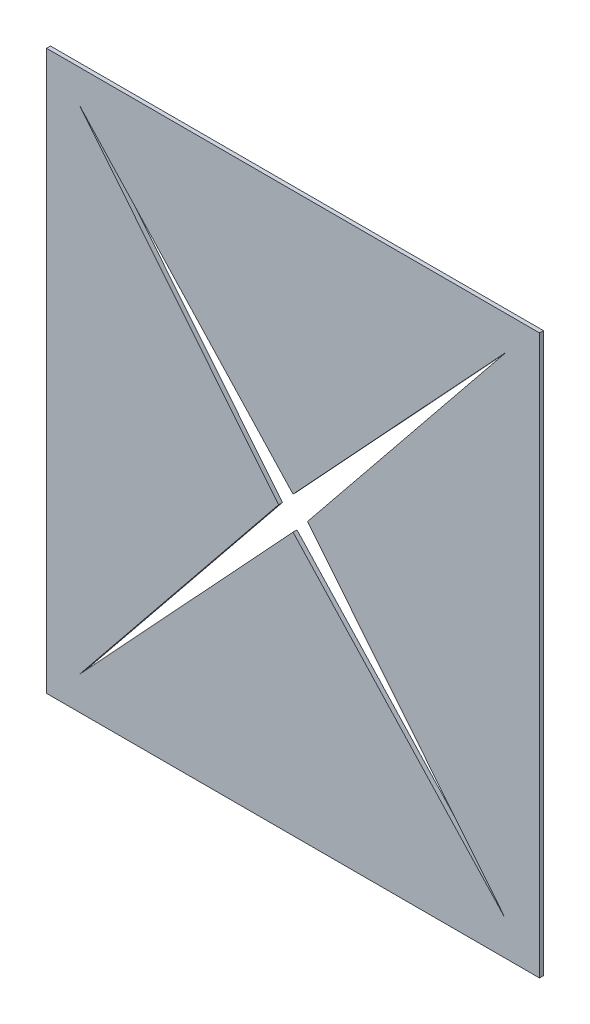
ISO-10303-21;
HEADER;
FILE_DESCRIPTION(('STEP AP214'),'2;1');
FILE_NAME('part.step','',(''),(''),'','','');
FILE_SCHEMA(('AUTOMOTIVE_DESIGN { 1 0 10303 214 1 1 1 1 }'));
ENDSEC;
DATA;
#1=APPLICATION_CONTEXT('core data for automotive mechanical design processes');
#2=APPLICATION_PROTOCOL_DEFINITION('international standard','automotive_design',2000,#1);
#3=PRODUCT_CONTEXT('',#1,'mechanical');
#4=PRODUCT('Part','Part','',(#3));
#5=PRODUCT_RELATED_PRODUCT_CATEGORY('part','',(#4));
#6=PRODUCT_DEFINITION_FORMATION('','',#4);
#7=PRODUCT_DEFINITION_CONTEXT('part definition',#1,'design');
#8=PRODUCT_DEFINITION('design','',#6,#7);
#9=PRODUCT_DEFINITION_SHAPE('','',#8);
#10=(LENGTH_UNIT() NAMED_UNIT(*) SI_UNIT(.MILLI.,.METRE.));
#11=(NAMED_UNIT(*) PLANE_ANGLE_UNIT() SI_UNIT($,.RADIAN.));
#12=(NAMED_UNIT(*) SI_UNIT($,.STERADIAN.) SOLID_ANGLE_UNIT());
#13=UNCERTAINTY_MEASURE_WITH_UNIT(LENGTH_MEASURE(1.E-05),#10,'distance_accuracy_value','');
#14=(GEOMETRIC_REPRESENTATION_CONTEXT(3) GLOBAL_UNCERTAINTY_ASSIGNED_CONTEXT((#13)) GLOBAL_UNIT_ASSIGNED_CONTEXT((#10,
#11,#12)) REPRESENTATION_CONTEXT('',''));
#15=CARTESIAN_POINT('',(0.,0.,0.));
#16=DIRECTION('',(0.,0.,1.));
#17=DIRECTION('',(1.,0.,0.));
#18=AXIS2_PLACEMENT_3D('',#15,#16,#17);
#19=CARTESIAN_POINT('',(1.58315068493149,-1.47006849315067,0.762));
#20=DIRECTION('',(0.7327934916263,-0.680451099367277,0.));
#21=DIRECTION('',(0.680451099367277,0.7327934916263,0.));
#22=AXIS2_PLACEMENT_3D('',#19,#20,#21);
#23=PLANE('',#22);
#24=DIRECTION('',(-0.680451099367277,-0.7327934916263,0.));
#25=VECTOR('',#24,1.);
#26=CARTESIAN_POINT('',(1.58315068493149,-1.47006849315067,0.));
#27=LINE('',#26,#25);
#28=CARTESIAN_POINT('',(0.,-3.17499999999999,0.));
#29=VERTEX_POINT('',#28);
#30=CARTESIAN_POINT('',(-41.275,-47.625,0.));
#31=VERTEX_POINT('',#30);
#32=EDGE_CURVE('E167',#29,#31,#27,.T.);
#33=ORIENTED_EDGE('',*,*,#32,.T.);
#34=DIRECTION('',(0.,0.,-1.));
#35=VECTOR('',#34,1.);
#36=CARTESIAN_POINT('',(-41.275,-47.625,0.762));
#37=LINE('',#36,#35);
#38=CARTESIAN_POINT('',(-41.275,-47.625,0.762));
#39=VERTEX_POINT('',#38);
#40=EDGE_CURVE('E11',#39,#31,#37,.T.);
#41=ORIENTED_EDGE('',*,*,#40,.F.);
#42=DIRECTION('',(-0.680451099367277,-0.7327934916263,0.));
#43=VECTOR('',#42,1.);
#44=CARTESIAN_POINT('',(1.58315068493149,-1.47006849315067,0.762));
#45=LINE('',#44,#43);
#46=CARTESIAN_POINT('',(0.,-3.17499999999999,0.762));
#47=VERTEX_POINT('',#46);
#48=EDGE_CURVE('E221',#47,#39,#45,.T.);
#49=ORIENTED_EDGE('',*,*,#48,.F.);
#50=DIRECTION('',(0.,0.,-1.));
#51=VECTOR('',#50,1.);
#52=CARTESIAN_POINT('',(0.,-3.17499999999999,0.762));
#53=LINE('',#52,#51);
#54=EDGE_CURVE('E187',#47,#29,#53,.T.);
#55=ORIENTED_EDGE('',*,*,#54,.T.);
#56=EDGE_LOOP('',(#33,#41,#49,#55));
#57=FACE_BOUND('',#56,.T.);
#58=ADVANCED_FACE('F35',(#57),#23,.F.);
#59=CARTESIAN_POINT('',(-1.69517894864186,1.3694386800793,0.762));
#60=DIRECTION('',(0.77788382600443,-0.628408110419264,0.));
#61=DIRECTION('',(0.628408110419264,0.77788382600443,0.));
#62=AXIS2_PLACEMENT_3D('',#59,#60,#61);
#63=PLANE('',#62);
#64=DIRECTION('',(-0.628408110419264,-0.77788382600443,0.));
#65=VECTOR('',#64,1.);
#66=CARTESIAN_POINT('',(-1.69517894864186,1.3694386800793,0.));
#67=LINE('',#66,#65);
#68=CARTESIAN_POINT('',(-2.80147058823532,0.,0.));
#69=VERTEX_POINT('',#68);
#70=EDGE_CURVE('E170',#69,#31,#67,.T.);
#71=ORIENTED_EDGE('',*,*,#70,.F.);
#72=DIRECTION('',(0.,0.,-1.));
#73=VECTOR('',#72,1.);
#74=CARTESIAN_POINT('',(-2.80147058823532,0.,0.762));
#75=LINE('',#74,#73);
#76=CARTESIAN_POINT('',(-2.80147058823532,0.,0.762));
#77=VERTEX_POINT('',#76);
#78=EDGE_CURVE('E45',#77,#69,#75,.T.);
#79=ORIENTED_EDGE('',*,*,#78,.F.);
#80=DIRECTION('',(-0.628408110419264,-0.77788382600443,0.));
#81=VECTOR('',#80,1.);
#82=CARTESIAN_POINT('',(-1.69517894864186,1.3694386800793,0.762));
#83=LINE('',#82,#81);
#84=EDGE_CURVE('E224',#77,#39,#83,.T.);
#85=ORIENTED_EDGE('',*,*,#84,.T.);
#86=ORIENTED_EDGE('',*,*,#40,.T.);
#87=EDGE_LOOP('',(#71,#79,#85,#86));
#88=FACE_BOUND('',#87,.T.);
#89=ADVANCED_FACE('F257',(#88),#63,.T.);
#90=CARTESIAN_POINT('',(-1.69517894864185,-1.36943868007929,0.762));
#91=DIRECTION('',(0.77788382600443,0.628408110419264,0.));
#92=DIRECTION('',(-0.628408110419264,0.77788382600443,0.));
#93=AXIS2_PLACEMENT_3D('',#90,#91,#92);
#94=PLANE('',#93);
#95=DIRECTION('',(0.628408110419264,-0.77788382600443,0.));
#96=VECTOR('',#95,1.);
#97=CARTESIAN_POINT('',(-1.69517894864185,-1.36943868007929,0.));
#98=LINE('',#97,#96);
#99=CARTESIAN_POINT('',(-41.275,47.625,0.));
#100=VERTEX_POINT('',#99);
#101=EDGE_CURVE('E173',#100,#69,#98,.T.);
#102=ORIENTED_EDGE('',*,*,#101,.F.);
#103=DIRECTION('',(0.,0.,-1.));
#104=VECTOR('',#103,1.);
#105=CARTESIAN_POINT('',(-41.275,47.625,0.762));
#106=LINE('',#105,#104);
#107=CARTESIAN_POINT('',(-41.275,47.625,0.762));
#108=VERTEX_POINT('',#107);
#109=EDGE_CURVE('E193',#108,#100,#106,.T.);
#110=ORIENTED_EDGE('',*,*,#109,.F.);
#111=DIRECTION('',(0.628408110419264,-0.77788382600443,0.));
#112=VECTOR('',#111,1.);
#113=CARTESIAN_POINT('',(-1.69517894864185,-1.36943868007929,0.762));
#114=LINE('',#113,#112);
#115=EDGE_CURVE('E231',#108,#77,#114,.T.);
#116=ORIENTED_EDGE('',*,*,#115,.T.);
#117=ORIENTED_EDGE('',*,*,#78,.T.);
#118=EDGE_LOOP('',(#102,#110,#116,#117));
#119=FACE_BOUND('',#118,.T.);
#120=ADVANCED_FACE('F262',(#119),#94,.T.);
#121=CARTESIAN_POINT('',(1.5831506849315,1.47006849315068,0.762));
#122=DIRECTION('',(-0.732793491626299,-0.680451099367278,0.));
#123=DIRECTION('',(0.680451099367278,-0.732793491626299,0.));
#124=AXIS2_PLACEMENT_3D('',#121,#122,#123);
#125=PLANE('',#124);
#126=DIRECTION('',(-0.680451099367278,0.732793491626299,0.));
#127=VECTOR('',#126,1.);
#128=CARTESIAN_POINT('',(1.5831506849315,1.47006849315068,0.));
#129=LINE('',#128,#127);
#130=CARTESIAN_POINT('',(0.,3.17500000000001,0.));
#131=VERTEX_POINT('',#130);
#132=EDGE_CURVE('E176',#131,#100,#129,.T.);
#133=ORIENTED_EDGE('',*,*,#132,.F.);
#134=DIRECTION('',(0.,0.,-1.));
#135=VECTOR('',#134,1.);
#136=CARTESIAN_POINT('',(0.,3.17500000000001,0.762));
#137=LINE('',#136,#135);
#138=CARTESIAN_POINT('',(0.,3.17500000000001,0.762));
#139=VERTEX_POINT('',#138);
#140=EDGE_CURVE('E191',#139,#131,#137,.T.);
#141=ORIENTED_EDGE('',*,*,#140,.F.);
#142=DIRECTION('',(-0.680451099367278,0.732793491626299,0.));
#143=VECTOR('',#142,1.);
#144=CARTESIAN_POINT('',(1.5831506849315,1.47006849315068,0.762));
#145=LINE('',#144,#143);
#146=EDGE_CURVE('E234',#139,#108,#145,.T.);
#147=ORIENTED_EDGE('',*,*,#146,.T.);
#148=ORIENTED_EDGE('',*,*,#109,.T.);
#149=EDGE_LOOP('',(#133,#141,#147,#148));
#150=FACE_BOUND('',#149,.T.);
#151=ADVANCED_FACE('F282',(#150),#125,.T.);
#152=CARTESIAN_POINT('',(-1.58315068493152,1.4700684931507,0.762));
#153=DIRECTION('',(0.732793491626299,-0.680451099367278,0.));
#154=DIRECTION('',(0.680451099367278,0.732793491626299,0.));
#155=AXIS2_PLACEMENT_3D('',#152,#153,#154);
#156=PLANE('',#155);
#157=DIRECTION('',(-0.680451099367278,-0.732793491626299,0.));
#158=VECTOR('',#157,1.);
#159=CARTESIAN_POINT('',(-1.58315068493152,1.4700684931507,0.));
#160=LINE('',#159,#158);
#161=CARTESIAN_POINT('',(41.275,47.625,0.));
#162=VERTEX_POINT('',#161);
#163=EDGE_CURVE('E179',#162,#131,#160,.T.);
#164=ORIENTED_EDGE('',*,*,#163,.F.);
#165=DIRECTION('',(0.,0.,-1.));
#166=VECTOR('',#165,1.);
#167=CARTESIAN_POINT('',(41.275,47.625,0.762));
#168=LINE('',#167,#166);
#169=CARTESIAN_POINT('',(41.275,47.625,0.762));
#170=VERTEX_POINT('',#169);
#171=EDGE_CURVE('E141',#170,#162,#168,.T.);
#172=ORIENTED_EDGE('',*,*,#171,.F.);
#173=DIRECTION('',(-0.680451099367278,-0.732793491626299,0.));
#174=VECTOR('',#173,1.);
#175=CARTESIAN_POINT('',(-1.58315068493152,1.4700684931507,0.762));
#176=LINE('',#175,#174);
#177=EDGE_CURVE('E148',#170,#139,#176,.T.);
#178=ORIENTED_EDGE('',*,*,#177,.T.);
#179=ORIENTED_EDGE('',*,*,#140,.T.);
#180=EDGE_LOOP('',(#164,#172,#178,#179));
#181=FACE_BOUND('',#180,.T.);
#182=ADVANCED_FACE('F238',(#181),#156,.T.);
#183=CARTESIAN_POINT('',(1.69517894864183,-1.36943868007928,0.762));
#184=DIRECTION('',(-0.777883826004429,0.628408110419264,0.));
#185=DIRECTION('',(-0.628408110419264,-0.77788382600443,0.));
#186=AXIS2_PLACEMENT_3D('',#183,#184,#185);
#187=PLANE('',#186);
#188=DIRECTION('',(0.628408110419264,0.77788382600443,0.));
#189=VECTOR('',#188,1.);
#190=CARTESIAN_POINT('',(1.69517894864183,-1.36943868007928,0.));
#191=LINE('',#190,#189);
#192=CARTESIAN_POINT('',(2.80147058823529,0.,0.));
#193=VERTEX_POINT('',#192);
#194=EDGE_CURVE('E136',#193,#162,#191,.T.);
#195=ORIENTED_EDGE('',*,*,#194,.F.);
#196=DIRECTION('',(0.,0.,-1.));
#197=VECTOR('',#196,1.);
#198=CARTESIAN_POINT('',(2.80147058823529,0.,0.762));
#199=LINE('',#198,#197);
#200=CARTESIAN_POINT('',(2.80147058823529,0.,0.762));
#201=VERTEX_POINT('',#200);
#202=EDGE_CURVE('E131',#201,#193,#199,.T.);
#203=ORIENTED_EDGE('',*,*,#202,.F.);
#204=DIRECTION('',(0.628408110419264,0.77788382600443,0.));
#205=VECTOR('',#204,1.);
#206=CARTESIAN_POINT('',(1.69517894864183,-1.36943868007928,0.762));
#207=LINE('',#206,#205);
#208=EDGE_CURVE('E134',#201,#170,#207,.T.);
#209=ORIENTED_EDGE('',*,*,#208,.T.);
#210=ORIENTED_EDGE('',*,*,#171,.T.);
#211=EDGE_LOOP('',(#195,#203,#209,#210));
#212=FACE_BOUND('',#211,.T.);
#213=ADVANCED_FACE('F133',(#212),#187,.T.);
#214=CARTESIAN_POINT('',(1.69517894864183,1.36943868007929,0.762));
#215=DIRECTION('',(-0.77788382600443,-0.628408110419264,0.));
#216=DIRECTION('',(0.628408110419264,-0.77788382600443,0.));
#217=AXIS2_PLACEMENT_3D('',#214,#215,#216);
#218=PLANE('',#217);
#219=DIRECTION('',(-0.628408110419264,0.77788382600443,0.));
#220=VECTOR('',#219,1.);
#221=CARTESIAN_POINT('',(1.69517894864183,1.36943868007929,0.));
#222=LINE('',#221,#220);
#223=CARTESIAN_POINT('',(41.275,-47.625,0.));
#224=VERTEX_POINT('',#223);
#225=EDGE_CURVE('E183',#224,#193,#222,.T.);
#226=ORIENTED_EDGE('',*,*,#225,.F.);
#227=DIRECTION('',(0.,0.,-1.));
#228=VECTOR('',#227,1.);
#229=CARTESIAN_POINT('',(41.275,-47.625,0.762));
#230=LINE('',#229,#228);
#231=CARTESIAN_POINT('',(41.275,-47.625,0.762));
#232=VERTEX_POINT('',#231);
#233=EDGE_CURVE('E93',#232,#224,#230,.T.);
#234=ORIENTED_EDGE('',*,*,#233,.F.);
#235=DIRECTION('',(-0.628408110419264,0.77788382600443,0.));
#236=VECTOR('',#235,1.);
#237=CARTESIAN_POINT('',(1.69517894864183,1.36943868007929,0.762));
#238=LINE('',#237,#236);
#239=EDGE_CURVE('E145',#232,#201,#238,.T.);
#240=ORIENTED_EDGE('',*,*,#239,.T.);
#241=ORIENTED_EDGE('',*,*,#202,.T.);
#242=EDGE_LOOP('',(#226,#234,#240,#241));
#243=FACE_BOUND('',#242,.T.);
#244=ADVANCED_FACE('F150',(#243),#218,.T.);
#245=CARTESIAN_POINT('',(47.625,0.,0.762));
#246=DIRECTION('',(1.,0.,0.));
#247=DIRECTION('',(0.,0.,-1.));
#248=AXIS2_PLACEMENT_3D('',#245,#246,#247);
#249=PLANE('',#248);
#250=DIRECTION('',(0.,-1.,0.));
#251=VECTOR('',#250,1.);
#252=CARTESIAN_POINT('',(47.625,0.,0.));
#253=LINE('',#252,#251);
#254=CARTESIAN_POINT('',(47.625,53.975,0.));
#255=VERTEX_POINT('',#254);
#256=CARTESIAN_POINT('',(47.625,-53.975,0.));
#257=VERTEX_POINT('',#256);
#258=EDGE_CURVE('E156',#255,#257,#253,.T.);
#259=ORIENTED_EDGE('',*,*,#258,.F.);
#260=DIRECTION('',(0.,0.,-1.));
#261=VECTOR('',#260,1.);
#262=CARTESIAN_POINT('',(47.625,53.975,0.762));
#263=LINE('',#262,#261);
#264=CARTESIAN_POINT('',(47.625,53.975,0.762));
#265=VERTEX_POINT('',#264);
#266=EDGE_CURVE('E39',#265,#255,#263,.T.);
#267=ORIENTED_EDGE('',*,*,#266,.F.);
#268=DIRECTION('',(0.,-1.,0.));
#269=VECTOR('',#268,1.);
#270=CARTESIAN_POINT('',(47.625,0.,0.762));
#271=LINE('',#270,#269);
#272=CARTESIAN_POINT('',(47.625,-53.975,0.762));
#273=VERTEX_POINT('',#272);
#274=EDGE_CURVE('E186',#265,#273,#271,.T.);
#275=ORIENTED_EDGE('',*,*,#274,.T.);
#276=DIRECTION('',(0.,0.,-1.));
#277=VECTOR('',#276,1.);
#278=CARTESIAN_POINT('',(47.625,-53.975,0.762));
#279=LINE('',#278,#277);
#280=EDGE_CURVE('E152',#273,#257,#279,.T.);
#281=ORIENTED_EDGE('',*,*,#280,.T.);
#282=EDGE_LOOP('',(#259,#267,#275,#281));
#283=FACE_BOUND('',#282,.T.);
#284=ADVANCED_FACE('F37',(#283),#249,.T.);
#285=CARTESIAN_POINT('',(0.,53.975,0.762));
#286=DIRECTION('',(0.,1.,0.));
#287=DIRECTION('',(0.,0.,1.));
#288=AXIS2_PLACEMENT_3D('',#285,#286,#287);
#289=PLANE('',#288);
#290=DIRECTION('',(1.,0.,0.));
#291=VECTOR('',#290,1.);
#292=CARTESIAN_POINT('',(0.,53.975,0.));
#293=LINE('',#292,#291);
#294=CARTESIAN_POINT('',(-47.625,53.975,0.));
#295=VERTEX_POINT('',#294);
#296=EDGE_CURVE('E159',#295,#255,#293,.T.);
#297=ORIENTED_EDGE('',*,*,#296,.F.);
#298=DIRECTION('',(0.,0.,-1.));
#299=VECTOR('',#298,1.);
#300=CARTESIAN_POINT('',(-47.625,53.975,0.762));
#301=LINE('',#300,#299);
#302=CARTESIAN_POINT('',(-47.625,53.975,0.762));
#303=VERTEX_POINT('',#302);
#304=EDGE_CURVE('E199',#303,#295,#301,.T.);
#305=ORIENTED_EDGE('',*,*,#304,.F.);
#306=DIRECTION('',(1.,0.,0.));
#307=VECTOR('',#306,1.);
#308=CARTESIAN_POINT('',(0.,53.975,0.762));
#309=LINE('',#308,#307);
#310=EDGE_CURVE('E208',#303,#265,#309,.T.);
#311=ORIENTED_EDGE('',*,*,#310,.T.);
#312=ORIENTED_EDGE('',*,*,#266,.T.);
#313=EDGE_LOOP('',(#297,#305,#311,#312));
#314=FACE_BOUND('',#313,.T.);
#315=ADVANCED_FACE('F206',(#314),#289,.T.);
#316=CARTESIAN_POINT('',(-47.625,0.,0.762));
#317=DIRECTION('',(1.,0.,0.));
#318=DIRECTION('',(0.,0.,-1.));
#319=AXIS2_PLACEMENT_3D('',#316,#317,#318);
#320=PLANE('',#319);
#321=DIRECTION('',(0.,-1.,0.));
#322=VECTOR('',#321,1.);
#323=CARTESIAN_POINT('',(-47.625,0.,0.));
#324=LINE('',#323,#322);
#325=CARTESIAN_POINT('',(-47.625,-53.975,0.));
#326=VERTEX_POINT('',#325);
#327=EDGE_CURVE('E162',#295,#326,#324,.T.);
#328=ORIENTED_EDGE('',*,*,#327,.T.);
#329=DIRECTION('',(0.,0.,-1.));
#330=VECTOR('',#329,1.);
#331=CARTESIAN_POINT('',(-47.625,-53.975,0.762));
#332=LINE('',#331,#330);
#333=CARTESIAN_POINT('',(-47.625,-53.975,0.762));
#334=VERTEX_POINT('',#333);
#335=EDGE_CURVE('E197',#334,#326,#332,.T.);
#336=ORIENTED_EDGE('',*,*,#335,.F.);
#337=DIRECTION('',(0.,-1.,0.));
#338=VECTOR('',#337,1.);
#339=CARTESIAN_POINT('',(-47.625,0.,0.762));
#340=LINE('',#339,#338);
#341=EDGE_CURVE('E222',#303,#334,#340,.T.);
#342=ORIENTED_EDGE('',*,*,#341,.F.);
#343=ORIENTED_EDGE('',*,*,#304,.T.);
#344=EDGE_LOOP('',(#328,#336,#342,#343));
#345=FACE_BOUND('',#344,.T.);
#346=ADVANCED_FACE('F215',(#345),#320,.F.);
#347=CARTESIAN_POINT('',(0.,-53.975,0.762));
#348=DIRECTION('',(0.,1.,0.));
#349=DIRECTION('',(0.,0.,1.));
#350=AXIS2_PLACEMENT_3D('',#347,#348,#349);
#351=PLANE('',#350);
#352=DIRECTION('',(1.,0.,0.));
#353=VECTOR('',#352,1.);
#354=CARTESIAN_POINT('',(0.,-53.975,0.));
#355=LINE('',#354,#353);
#356=EDGE_CURVE('E164',#326,#257,#355,.T.);
#357=ORIENTED_EDGE('',*,*,#356,.T.);
#358=ORIENTED_EDGE('',*,*,#280,.F.);
#359=DIRECTION('',(1.,0.,0.));
#360=VECTOR('',#359,1.);
#361=CARTESIAN_POINT('',(0.,-53.975,0.762));
#362=LINE('',#361,#360);
#363=EDGE_CURVE('E219',#334,#273,#362,.T.);
#364=ORIENTED_EDGE('',*,*,#363,.F.);
#365=ORIENTED_EDGE('',*,*,#335,.T.);
#366=EDGE_LOOP('',(#357,#358,#364,#365));
#367=FACE_BOUND('',#366,.T.);
#368=ADVANCED_FACE('F218',(#367),#351,.F.);
#369=CARTESIAN_POINT('',(-1.58315068493151,-1.47006849315068,0.762));
#370=DIRECTION('',(-0.732793491626299,-0.680451099367277,0.));
#371=DIRECTION('',(0.680451099367277,-0.732793491626299,0.));
#372=AXIS2_PLACEMENT_3D('',#369,#370,#371);
#373=PLANE('',#372);
#374=DIRECTION('',(-0.680451099367278,0.732793491626299,0.));
#375=VECTOR('',#374,1.);
#376=CARTESIAN_POINT('',(-1.58315068493151,-1.47006849315068,0.));
#377=LINE('',#376,#375);
#378=EDGE_CURVE('E96',#224,#29,#377,.T.);
#379=ORIENTED_EDGE('',*,*,#378,.T.);
#380=ORIENTED_EDGE('',*,*,#54,.F.);
#381=DIRECTION('',(-0.680451099367278,0.732793491626299,0.));
#382=VECTOR('',#381,1.);
#383=CARTESIAN_POINT('',(-1.58315068493151,-1.47006849315068,0.762));
#384=LINE('',#383,#382);
#385=EDGE_CURVE('E54',#232,#47,#384,.T.);
#386=ORIENTED_EDGE('',*,*,#385,.F.);
#387=ORIENTED_EDGE('',*,*,#233,.T.);
#388=EDGE_LOOP('',(#379,#380,#386,#387));
#389=FACE_BOUND('',#388,.T.);
#390=ADVANCED_FACE('F245',(#389),#373,.F.);
#391=CARTESIAN_POINT('',(0.,0.,0.762));
#392=DIRECTION('',(0.,0.,1.));
#393=DIRECTION('',(1.,0.,0.));
#394=AXIS2_PLACEMENT_3D('',#391,#392,#393);
#395=PLANE('',#394);
#396=ORIENTED_EDGE('',*,*,#274,.F.);
#397=ORIENTED_EDGE('',*,*,#310,.F.);
#398=ORIENTED_EDGE('',*,*,#341,.T.);
#399=ORIENTED_EDGE('',*,*,#363,.T.);
#400=EDGE_LOOP('',(#396,#397,#398,#399));
#401=FACE_BOUND('',#400,.T.);
#402=ORIENTED_EDGE('',*,*,#48,.T.);
#403=ORIENTED_EDGE('',*,*,#84,.F.);
#404=ORIENTED_EDGE('',*,*,#115,.F.);
#405=ORIENTED_EDGE('',*,*,#146,.F.);
#406=ORIENTED_EDGE('',*,*,#177,.F.);
#407=ORIENTED_EDGE('',*,*,#208,.F.);
#408=ORIENTED_EDGE('',*,*,#239,.F.);
#409=ORIENTED_EDGE('',*,*,#385,.T.);
#410=EDGE_LOOP('',(#402,#403,#404,#405,#406,#407,#408,#409));
#411=FACE_BOUND('',#410,.T.);
#412=ADVANCED_FACE('F144',(#401,#411),#395,.T.);
#413=CARTESIAN_POINT('',(0.,0.,0.));
#414=DIRECTION('',(0.,0.,1.));
#415=DIRECTION('',(1.,0.,0.));
#416=AXIS2_PLACEMENT_3D('',#413,#414,#415);
#417=PLANE('',#416);
#418=ORIENTED_EDGE('',*,*,#258,.T.);
#419=ORIENTED_EDGE('',*,*,#356,.F.);
#420=ORIENTED_EDGE('',*,*,#327,.F.);
#421=ORIENTED_EDGE('',*,*,#296,.T.);
#422=EDGE_LOOP('',(#418,#419,#420,#421));
#423=FACE_BOUND('',#422,.T.);
#424=ORIENTED_EDGE('',*,*,#32,.F.);
#425=ORIENTED_EDGE('',*,*,#378,.F.);
#426=ORIENTED_EDGE('',*,*,#225,.T.);
#427=ORIENTED_EDGE('',*,*,#194,.T.);
#428=ORIENTED_EDGE('',*,*,#163,.T.);
#429=ORIENTED_EDGE('',*,*,#132,.T.);
#430=ORIENTED_EDGE('',*,*,#101,.T.);
#431=ORIENTED_EDGE('',*,*,#70,.T.);
#432=EDGE_LOOP('',(#424,#425,#426,#427,#428,#429,#430,#431));
#433=FACE_BOUND('',#432,.T.);
#434=ADVANCED_FACE('F212',(#423,#433),#417,.F.);
#435=CLOSED_SHELL('',(#58,#89,#120,#151,#182,#213,#244,#284,#315,#346,#368,#390,#412,#434));
#436=MANIFOLD_SOLID_BREP('B2',#435);
#437=ADVANCED_BREP_SHAPE_REPRESENTATION('',(#18,#436),#14);
#438=SHAPE_DEFINITION_REPRESENTATION(#9,#437);
ENDSEC;
END-ISO-10303-21;
